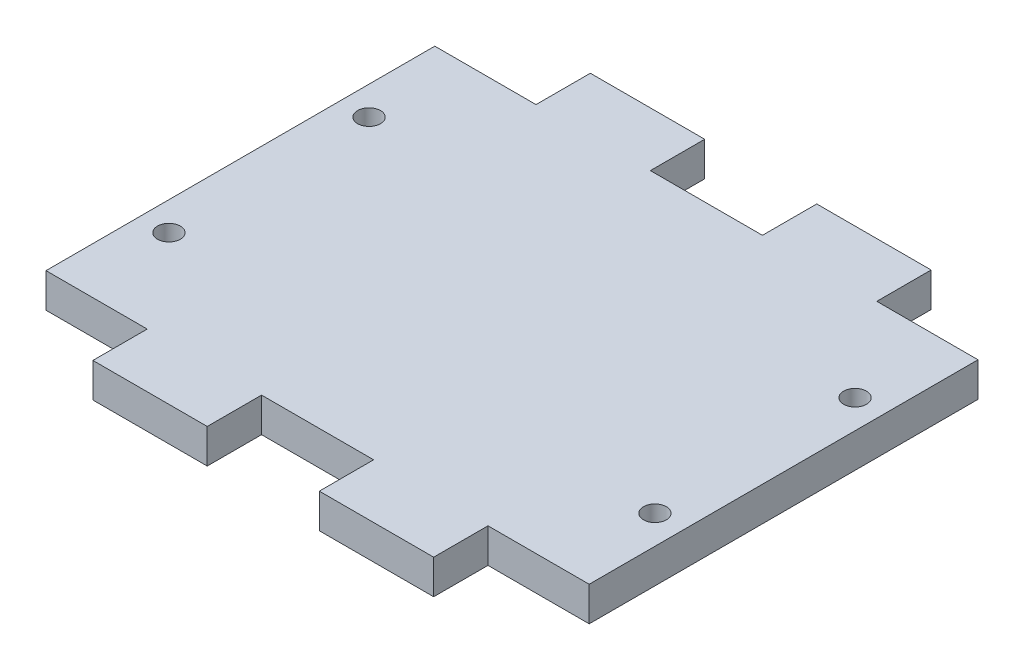
ISO-10303-21;
HEADER;
FILE_DESCRIPTION(('STEP AP214'),'2;1');
FILE_NAME('part.step','',(''),(''),'','','');
FILE_SCHEMA(('AUTOMOTIVE_DESIGN { 1 0 10303 214 1 1 1 1 }'));
ENDSEC;
DATA;
#1=APPLICATION_CONTEXT('core data for automotive mechanical design processes');
#2=APPLICATION_PROTOCOL_DEFINITION('international standard','automotive_design',2000,#1);
#3=PRODUCT_CONTEXT('',#1,'mechanical');
#4=PRODUCT('Part','Part','',(#3));
#5=PRODUCT_RELATED_PRODUCT_CATEGORY('part','',(#4));
#6=PRODUCT_DEFINITION_FORMATION('','',#4);
#7=PRODUCT_DEFINITION_CONTEXT('part definition',#1,'design');
#8=PRODUCT_DEFINITION('design','',#6,#7);
#9=PRODUCT_DEFINITION_SHAPE('','',#8);
#10=(LENGTH_UNIT() NAMED_UNIT(*) SI_UNIT(.MILLI.,.METRE.));
#11=(NAMED_UNIT(*) PLANE_ANGLE_UNIT() SI_UNIT($,.RADIAN.));
#12=(NAMED_UNIT(*) SI_UNIT($,.STERADIAN.) SOLID_ANGLE_UNIT());
#13=UNCERTAINTY_MEASURE_WITH_UNIT(LENGTH_MEASURE(1.E-05),#10,'distance_accuracy_value','');
#14=(GEOMETRIC_REPRESENTATION_CONTEXT(3) GLOBAL_UNCERTAINTY_ASSIGNED_CONTEXT((#13)) GLOBAL_UNIT_ASSIGNED_CONTEXT((#10,
#11,#12)) REPRESENTATION_CONTEXT('',''));
#15=CARTESIAN_POINT('',(0.,0.,0.));
#16=DIRECTION('',(0.,0.,1.));
#17=DIRECTION('',(1.,0.,0.));
#18=AXIS2_PLACEMENT_3D('',#15,#16,#17);
#19=CARTESIAN_POINT('',(4.89999999999999,3.,0.));
#20=DIRECTION('',(-1.,0.,0.));
#21=DIRECTION('',(0.,0.,1.));
#22=AXIS2_PLACEMENT_3D('',#19,#20,#21);
#23=PLANE('',#22);
#24=DIRECTION('',(0.,0.,-1.));
#25=VECTOR('',#24,1.);
#26=CARTESIAN_POINT('',(4.89999999999999,0.,0.));
#27=LINE('',#26,#25);
#28=CARTESIAN_POINT('',(4.89999999999999,0.,-17.0000000000001));
#29=VERTEX_POINT('',#28);
#30=CARTESIAN_POINT('',(4.89999999999999,0.,-21.7500000000001));
#31=VERTEX_POINT('',#30);
#32=EDGE_CURVE('E215',#29,#31,#27,.T.);
#33=ORIENTED_EDGE('',*,*,#32,.F.);
#34=DIRECTION('',(0.,-1.,0.));
#35=VECTOR('',#34,1.);
#36=CARTESIAN_POINT('',(4.89999999999999,3.,-17.0000000000001));
#37=LINE('',#36,#35);
#38=CARTESIAN_POINT('',(4.89999999999999,3.,-17.0000000000001));
#39=VERTEX_POINT('',#38);
#40=EDGE_CURVE('E11',#39,#29,#37,.T.);
#41=ORIENTED_EDGE('',*,*,#40,.F.);
#42=DIRECTION('',(0.,0.,-1.));
#43=VECTOR('',#42,1.);
#44=CARTESIAN_POINT('',(4.89999999999999,3.,0.));
#45=LINE('',#44,#43);
#46=CARTESIAN_POINT('',(4.89999999999999,3.,-21.7500000000001));
#47=VERTEX_POINT('',#46);
#48=EDGE_CURVE('E285',#39,#47,#45,.T.);
#49=ORIENTED_EDGE('',*,*,#48,.T.);
#50=DIRECTION('',(0.,-1.,0.));
#51=VECTOR('',#50,1.);
#52=CARTESIAN_POINT('',(4.89999999999999,3.,-21.7500000000001));
#53=LINE('',#52,#51);
#54=EDGE_CURVE('E60',#47,#31,#53,.T.);
#55=ORIENTED_EDGE('',*,*,#54,.T.);
#56=EDGE_LOOP('',(#33,#41,#49,#55));
#57=FACE_BOUND('',#56,.T.);
#58=ADVANCED_FACE('F41',(#57),#23,.T.);
#59=CARTESIAN_POINT('',(0.,3.,-17.0000000000001));
#60=DIRECTION('',(0.,0.,1.));
#61=DIRECTION('',(1.,0.,0.));
#62=AXIS2_PLACEMENT_3D('',#59,#60,#61);
#63=PLANE('',#62);
#64=DIRECTION('',(-1.,0.,0.));
#65=VECTOR('',#64,1.);
#66=CARTESIAN_POINT('',(0.,0.,-17.0000000000001));
#67=LINE('',#66,#65);
#68=CARTESIAN_POINT('',(-4.90000000000001,0.,-17.0000000000001));
#69=VERTEX_POINT('',#68);
#70=EDGE_CURVE('E218',#29,#69,#67,.T.);
#71=ORIENTED_EDGE('',*,*,#70,.T.);
#72=DIRECTION('',(0.,-1.,0.));
#73=VECTOR('',#72,1.);
#74=CARTESIAN_POINT('',(-4.90000000000001,3.,-17.0000000000001));
#75=LINE('',#74,#73);
#76=CARTESIAN_POINT('',(-4.90000000000001,3.,-17.0000000000001));
#77=VERTEX_POINT('',#76);
#78=EDGE_CURVE('E51',#77,#69,#75,.T.);
#79=ORIENTED_EDGE('',*,*,#78,.F.);
#80=DIRECTION('',(-1.,0.,0.));
#81=VECTOR('',#80,1.);
#82=CARTESIAN_POINT('',(0.,3.,-17.0000000000001));
#83=LINE('',#82,#81);
#84=EDGE_CURVE('E476',#39,#77,#83,.T.);
#85=ORIENTED_EDGE('',*,*,#84,.F.);
#86=ORIENTED_EDGE('',*,*,#40,.T.);
#87=EDGE_LOOP('',(#71,#79,#85,#86));
#88=FACE_BOUND('',#87,.T.);
#89=ADVANCED_FACE('F374',(#88),#63,.F.);
#90=CARTESIAN_POINT('',(-4.90000000000001,3.,0.));
#91=DIRECTION('',(-1.,0.,0.));
#92=DIRECTION('',(0.,0.,1.));
#93=AXIS2_PLACEMENT_3D('',#90,#91,#92);
#94=PLANE('',#93);
#95=DIRECTION('',(0.,0.,-1.));
#96=VECTOR('',#95,1.);
#97=CARTESIAN_POINT('',(-4.90000000000001,0.,0.));
#98=LINE('',#97,#96);
#99=CARTESIAN_POINT('',(-4.90000000000001,0.,-21.7500000000001));
#100=VERTEX_POINT('',#99);
#101=EDGE_CURVE('E221',#69,#100,#98,.T.);
#102=ORIENTED_EDGE('',*,*,#101,.T.);
#103=DIRECTION('',(0.,-1.,0.));
#104=VECTOR('',#103,1.);
#105=CARTESIAN_POINT('',(-4.90000000000001,3.,-21.7500000000001));
#106=LINE('',#105,#104);
#107=CARTESIAN_POINT('',(-4.90000000000001,3.,-21.7500000000001));
#108=VERTEX_POINT('',#107);
#109=EDGE_CURVE('E335',#108,#100,#106,.T.);
#110=ORIENTED_EDGE('',*,*,#109,.F.);
#111=DIRECTION('',(0.,0.,-1.));
#112=VECTOR('',#111,1.);
#113=CARTESIAN_POINT('',(-4.90000000000001,3.,0.));
#114=LINE('',#113,#112);
#115=EDGE_CURVE('E470',#77,#108,#114,.T.);
#116=ORIENTED_EDGE('',*,*,#115,.F.);
#117=ORIENTED_EDGE('',*,*,#78,.T.);
#118=EDGE_LOOP('',(#102,#110,#116,#117));
#119=FACE_BOUND('',#118,.T.);
#120=ADVANCED_FACE('F378',(#119),#94,.F.);
#121=CARTESIAN_POINT('',(0.,3.,-21.7500000000001));
#122=DIRECTION('',(0.,0.,-1.));
#123=DIRECTION('',(-1.,0.,0.));
#124=AXIS2_PLACEMENT_3D('',#121,#122,#123);
#125=PLANE('',#124);
#126=DIRECTION('',(1.,0.,0.));
#127=VECTOR('',#126,1.);
#128=CARTESIAN_POINT('',(0.,0.,-21.7500000000001));
#129=LINE('',#128,#127);
#130=CARTESIAN_POINT('',(-14.9,0.,-21.7500000000001));
#131=VERTEX_POINT('',#130);
#132=EDGE_CURVE('E225',#131,#100,#129,.T.);
#133=ORIENTED_EDGE('',*,*,#132,.F.);
#134=DIRECTION('',(0.,-1.,0.));
#135=VECTOR('',#134,1.);
#136=CARTESIAN_POINT('',(-14.9,3.,-21.7500000000001));
#137=LINE('',#136,#135);
#138=CARTESIAN_POINT('',(-14.9,3.,-21.7500000000001));
#139=VERTEX_POINT('',#138);
#140=EDGE_CURVE('E332',#139,#131,#137,.T.);
#141=ORIENTED_EDGE('',*,*,#140,.F.);
#142=DIRECTION('',(1.,0.,0.));
#143=VECTOR('',#142,1.);
#144=CARTESIAN_POINT('',(0.,3.,-21.7500000000001));
#145=LINE('',#144,#143);
#146=EDGE_CURVE('E465',#139,#108,#145,.T.);
#147=ORIENTED_EDGE('',*,*,#146,.T.);
#148=ORIENTED_EDGE('',*,*,#109,.T.);
#149=EDGE_LOOP('',(#133,#141,#147,#148));
#150=FACE_BOUND('',#149,.T.);
#151=ADVANCED_FACE('F448',(#150),#125,.T.);
#152=CARTESIAN_POINT('',(-14.9,3.,0.));
#153=DIRECTION('',(-1.,0.,0.));
#154=DIRECTION('',(0.,0.,1.));
#155=AXIS2_PLACEMENT_3D('',#152,#153,#154);
#156=PLANE('',#155);
#157=DIRECTION('',(0.,0.,-1.));
#158=VECTOR('',#157,1.);
#159=CARTESIAN_POINT('',(-14.9,0.,0.));
#160=LINE('',#159,#158);
#161=CARTESIAN_POINT('',(-14.9,0.,-17.0000000000001));
#162=VERTEX_POINT('',#161);
#163=EDGE_CURVE('E229',#162,#131,#160,.T.);
#164=ORIENTED_EDGE('',*,*,#163,.F.);
#165=DIRECTION('',(0.,-1.,0.));
#166=VECTOR('',#165,1.);
#167=CARTESIAN_POINT('',(-14.9,3.,-17.0000000000001));
#168=LINE('',#167,#166);
#169=CARTESIAN_POINT('',(-14.9,3.,-17.0000000000001));
#170=VERTEX_POINT('',#169);
#171=EDGE_CURVE('E329',#170,#162,#168,.T.);
#172=ORIENTED_EDGE('',*,*,#171,.F.);
#173=DIRECTION('',(0.,0.,-1.));
#174=VECTOR('',#173,1.);
#175=CARTESIAN_POINT('',(-14.9,3.,0.));
#176=LINE('',#175,#174);
#177=EDGE_CURVE('E469',#170,#139,#176,.T.);
#178=ORIENTED_EDGE('',*,*,#177,.T.);
#179=ORIENTED_EDGE('',*,*,#140,.T.);
#180=EDGE_LOOP('',(#164,#172,#178,#179));
#181=FACE_BOUND('',#180,.T.);
#182=ADVANCED_FACE('F444',(#181),#156,.T.);
#183=CARTESIAN_POINT('',(0.,3.,-17.0000000000001));
#184=DIRECTION('',(0.,0.,1.));
#185=DIRECTION('',(1.,0.,0.));
#186=AXIS2_PLACEMENT_3D('',#183,#184,#185);
#187=PLANE('',#186);
#188=DIRECTION('',(-1.,0.,0.));
#189=VECTOR('',#188,1.);
#190=CARTESIAN_POINT('',(0.,0.,-17.0000000000001));
#191=LINE('',#190,#189);
#192=CARTESIAN_POINT('',(-23.75,0.,-17.0000000000001));
#193=VERTEX_POINT('',#192);
#194=EDGE_CURVE('E233',#162,#193,#191,.T.);
#195=ORIENTED_EDGE('',*,*,#194,.T.);
#196=DIRECTION('',(0.,-1.,0.));
#197=VECTOR('',#196,1.);
#198=CARTESIAN_POINT('',(-23.75,3.,-17.0000000000001));
#199=LINE('',#198,#197);
#200=CARTESIAN_POINT('',(-23.75,3.,-17.0000000000001));
#201=VERTEX_POINT('',#200);
#202=EDGE_CURVE('E326',#201,#193,#199,.T.);
#203=ORIENTED_EDGE('',*,*,#202,.F.);
#204=DIRECTION('',(-1.,0.,0.));
#205=VECTOR('',#204,1.);
#206=CARTESIAN_POINT('',(0.,3.,-17.0000000000001));
#207=LINE('',#206,#205);
#208=EDGE_CURVE('E474',#170,#201,#207,.T.);
#209=ORIENTED_EDGE('',*,*,#208,.F.);
#210=ORIENTED_EDGE('',*,*,#171,.T.);
#211=EDGE_LOOP('',(#195,#203,#209,#210));
#212=FACE_BOUND('',#211,.T.);
#213=ADVANCED_FACE('F440',(#212),#187,.F.);
#214=CARTESIAN_POINT('',(-23.75,3.,0.));
#215=DIRECTION('',(-1.,0.,0.));
#216=DIRECTION('',(0.,0.,1.));
#217=AXIS2_PLACEMENT_3D('',#214,#215,#216);
#218=PLANE('',#217);
#219=DIRECTION('',(0.,0.,-1.));
#220=VECTOR('',#219,1.);
#221=CARTESIAN_POINT('',(-23.75,0.,0.));
#222=LINE('',#221,#220);
#223=CARTESIAN_POINT('',(-23.75,0.,16.9999999999999));
#224=VERTEX_POINT('',#223);
#225=EDGE_CURVE('E237',#224,#193,#222,.T.);
#226=ORIENTED_EDGE('',*,*,#225,.F.);
#227=DIRECTION('',(0.,-1.,0.));
#228=VECTOR('',#227,1.);
#229=CARTESIAN_POINT('',(-23.75,3.,16.9999999999999));
#230=LINE('',#229,#228);
#231=CARTESIAN_POINT('',(-23.75,3.,16.9999999999999));
#232=VERTEX_POINT('',#231);
#233=EDGE_CURVE('E323',#232,#224,#230,.T.);
#234=ORIENTED_EDGE('',*,*,#233,.F.);
#235=DIRECTION('',(0.,0.,-1.));
#236=VECTOR('',#235,1.);
#237=CARTESIAN_POINT('',(-23.75,3.,0.));
#238=LINE('',#237,#236);
#239=EDGE_CURVE('E482',#232,#201,#238,.T.);
#240=ORIENTED_EDGE('',*,*,#239,.T.);
#241=ORIENTED_EDGE('',*,*,#202,.T.);
#242=EDGE_LOOP('',(#226,#234,#240,#241));
#243=FACE_BOUND('',#242,.T.);
#244=ADVANCED_FACE('F436',(#243),#218,.T.);
#245=CARTESIAN_POINT('',(0.,3.,16.9999999999999));
#246=DIRECTION('',(0.,0.,-1.));
#247=DIRECTION('',(-1.,0.,0.));
#248=AXIS2_PLACEMENT_3D('',#245,#246,#247);
#249=PLANE('',#248);
#250=DIRECTION('',(1.,0.,0.));
#251=VECTOR('',#250,1.);
#252=CARTESIAN_POINT('',(0.,0.,16.9999999999999));
#253=LINE('',#252,#251);
#254=CARTESIAN_POINT('',(-14.9,0.,16.9999999999999));
#255=VERTEX_POINT('',#254);
#256=EDGE_CURVE('E241',#224,#255,#253,.T.);
#257=ORIENTED_EDGE('',*,*,#256,.T.);
#258=DIRECTION('',(0.,-1.,0.));
#259=VECTOR('',#258,1.);
#260=CARTESIAN_POINT('',(-14.9,3.,16.9999999999999));
#261=LINE('',#260,#259);
#262=CARTESIAN_POINT('',(-14.9,3.,16.9999999999999));
#263=VERTEX_POINT('',#262);
#264=EDGE_CURVE('E319',#263,#255,#261,.T.);
#265=ORIENTED_EDGE('',*,*,#264,.F.);
#266=DIRECTION('',(1.,0.,0.));
#267=VECTOR('',#266,1.);
#268=CARTESIAN_POINT('',(0.,3.,16.9999999999999));
#269=LINE('',#268,#267);
#270=EDGE_CURVE('E486',#232,#263,#269,.T.);
#271=ORIENTED_EDGE('',*,*,#270,.F.);
#272=ORIENTED_EDGE('',*,*,#233,.T.);
#273=EDGE_LOOP('',(#257,#265,#271,#272));
#274=FACE_BOUND('',#273,.T.);
#275=ADVANCED_FACE('F432',(#274),#249,.F.);
#276=CARTESIAN_POINT('',(-14.9,3.,0.));
#277=DIRECTION('',(1.,0.,0.));
#278=DIRECTION('',(0.,0.,-1.));
#279=AXIS2_PLACEMENT_3D('',#276,#277,#278);
#280=PLANE('',#279);
#281=DIRECTION('',(0.,0.,1.));
#282=VECTOR('',#281,1.);
#283=CARTESIAN_POINT('',(-14.9,0.,0.));
#284=LINE('',#283,#282);
#285=CARTESIAN_POINT('',(-14.9,0.,21.7499999999999));
#286=VERTEX_POINT('',#285);
#287=EDGE_CURVE('E244',#255,#286,#284,.T.);
#288=ORIENTED_EDGE('',*,*,#287,.T.);
#289=DIRECTION('',(0.,-1.,0.));
#290=VECTOR('',#289,1.);
#291=CARTESIAN_POINT('',(-14.9,3.,21.7499999999999));
#292=LINE('',#291,#290);
#293=CARTESIAN_POINT('',(-14.9,3.,21.7499999999999));
#294=VERTEX_POINT('',#293);
#295=EDGE_CURVE('E315',#294,#286,#292,.T.);
#296=ORIENTED_EDGE('',*,*,#295,.F.);
#297=DIRECTION('',(0.,0.,1.));
#298=VECTOR('',#297,1.);
#299=CARTESIAN_POINT('',(-14.9,3.,0.));
#300=LINE('',#299,#298);
#301=EDGE_CURVE('E489',#263,#294,#300,.T.);
#302=ORIENTED_EDGE('',*,*,#301,.F.);
#303=ORIENTED_EDGE('',*,*,#264,.T.);
#304=EDGE_LOOP('',(#288,#296,#302,#303));
#305=FACE_BOUND('',#304,.T.);
#306=ADVANCED_FACE('F428',(#305),#280,.F.);
#307=CARTESIAN_POINT('',(0.,3.,21.7499999999999));
#308=DIRECTION('',(0.,0.,-1.));
#309=DIRECTION('',(-1.,0.,0.));
#310=AXIS2_PLACEMENT_3D('',#307,#308,#309);
#311=PLANE('',#310);
#312=DIRECTION('',(1.,0.,0.));
#313=VECTOR('',#312,1.);
#314=CARTESIAN_POINT('',(0.,0.,21.7499999999999));
#315=LINE('',#314,#313);
#316=CARTESIAN_POINT('',(-4.9,0.,21.7499999999999));
#317=VERTEX_POINT('',#316);
#318=EDGE_CURVE('E247',#286,#317,#315,.T.);
#319=ORIENTED_EDGE('',*,*,#318,.T.);
#320=DIRECTION('',(0.,-1.,0.));
#321=VECTOR('',#320,1.);
#322=CARTESIAN_POINT('',(-4.9,3.,21.7499999999999));
#323=LINE('',#322,#321);
#324=CARTESIAN_POINT('',(-4.9,3.,21.7499999999999));
#325=VERTEX_POINT('',#324);
#326=EDGE_CURVE('E312',#325,#317,#323,.T.);
#327=ORIENTED_EDGE('',*,*,#326,.F.);
#328=DIRECTION('',(1.,0.,0.));
#329=VECTOR('',#328,1.);
#330=CARTESIAN_POINT('',(0.,3.,21.7499999999999));
#331=LINE('',#330,#329);
#332=EDGE_CURVE('E492',#294,#325,#331,.T.);
#333=ORIENTED_EDGE('',*,*,#332,.F.);
#334=ORIENTED_EDGE('',*,*,#295,.T.);
#335=EDGE_LOOP('',(#319,#327,#333,#334));
#336=FACE_BOUND('',#335,.T.);
#337=ADVANCED_FACE('F424',(#336),#311,.F.);
#338=CARTESIAN_POINT('',(-4.90000000000001,3.,0.));
#339=DIRECTION('',(1.,0.,0.));
#340=DIRECTION('',(0.,0.,-1.));
#341=AXIS2_PLACEMENT_3D('',#338,#339,#340);
#342=PLANE('',#341);
#343=DIRECTION('',(0.,0.,1.));
#344=VECTOR('',#343,1.);
#345=CARTESIAN_POINT('',(-4.90000000000001,0.,0.));
#346=LINE('',#345,#344);
#347=CARTESIAN_POINT('',(-4.90000000000001,0.,16.9999999999999));
#348=VERTEX_POINT('',#347);
#349=EDGE_CURVE('E251',#348,#317,#346,.T.);
#350=ORIENTED_EDGE('',*,*,#349,.F.);
#351=DIRECTION('',(0.,-1.,0.));
#352=VECTOR('',#351,1.);
#353=CARTESIAN_POINT('',(-4.90000000000001,3.,16.9999999999999));
#354=LINE('',#353,#352);
#355=CARTESIAN_POINT('',(-4.90000000000001,3.,16.9999999999999));
#356=VERTEX_POINT('',#355);
#357=EDGE_CURVE('E309',#356,#348,#354,.T.);
#358=ORIENTED_EDGE('',*,*,#357,.F.);
#359=DIRECTION('',(0.,0.,1.));
#360=VECTOR('',#359,1.);
#361=CARTESIAN_POINT('',(-4.90000000000001,3.,0.));
#362=LINE('',#361,#360);
#363=EDGE_CURVE('E495',#356,#325,#362,.T.);
#364=ORIENTED_EDGE('',*,*,#363,.T.);
#365=ORIENTED_EDGE('',*,*,#326,.T.);
#366=EDGE_LOOP('',(#350,#358,#364,#365));
#367=FACE_BOUND('',#366,.T.);
#368=ADVANCED_FACE('F420',(#367),#342,.T.);
#369=CARTESIAN_POINT('',(0.,3.,16.9999999999999));
#370=DIRECTION('',(0.,0.,-1.));
#371=DIRECTION('',(-1.,0.,0.));
#372=AXIS2_PLACEMENT_3D('',#369,#370,#371);
#373=PLANE('',#372);
#374=DIRECTION('',(1.,0.,0.));
#375=VECTOR('',#374,1.);
#376=CARTESIAN_POINT('',(0.,0.,16.9999999999999));
#377=LINE('',#376,#375);
#378=CARTESIAN_POINT('',(4.89999999999999,0.,16.9999999999999));
#379=VERTEX_POINT('',#378);
#380=EDGE_CURVE('E255',#348,#379,#377,.T.);
#381=ORIENTED_EDGE('',*,*,#380,.T.);
#382=DIRECTION('',(0.,-1.,0.));
#383=VECTOR('',#382,1.);
#384=CARTESIAN_POINT('',(4.89999999999999,3.,16.9999999999999));
#385=LINE('',#384,#383);
#386=CARTESIAN_POINT('',(4.89999999999999,3.,16.9999999999999));
#387=VERTEX_POINT('',#386);
#388=EDGE_CURVE('E305',#387,#379,#385,.T.);
#389=ORIENTED_EDGE('',*,*,#388,.F.);
#390=DIRECTION('',(1.,0.,0.));
#391=VECTOR('',#390,1.);
#392=CARTESIAN_POINT('',(0.,3.,16.9999999999999));
#393=LINE('',#392,#391);
#394=EDGE_CURVE('E499',#356,#387,#393,.T.);
#395=ORIENTED_EDGE('',*,*,#394,.F.);
#396=ORIENTED_EDGE('',*,*,#357,.T.);
#397=EDGE_LOOP('',(#381,#389,#395,#396));
#398=FACE_BOUND('',#397,.T.);
#399=ADVANCED_FACE('F416',(#398),#373,.F.);
#400=CARTESIAN_POINT('',(4.89999999999997,3.,0.));
#401=DIRECTION('',(1.,0.,0.));
#402=DIRECTION('',(0.,0.,-1.));
#403=AXIS2_PLACEMENT_3D('',#400,#401,#402);
#404=PLANE('',#403);
#405=DIRECTION('',(0.,0.,1.));
#406=VECTOR('',#405,1.);
#407=CARTESIAN_POINT('',(4.89999999999997,0.,0.));
#408=LINE('',#407,#406);
#409=CARTESIAN_POINT('',(4.89999999999999,0.,21.7499999999999));
#410=VERTEX_POINT('',#409);
#411=EDGE_CURVE('E258',#379,#410,#408,.T.);
#412=ORIENTED_EDGE('',*,*,#411,.T.);
#413=DIRECTION('',(0.,-1.,0.));
#414=VECTOR('',#413,1.);
#415=CARTESIAN_POINT('',(4.89999999999999,3.,21.7499999999999));
#416=LINE('',#415,#414);
#417=CARTESIAN_POINT('',(4.89999999999999,3.,21.7499999999999));
#418=VERTEX_POINT('',#417);
#419=EDGE_CURVE('E301',#418,#410,#416,.T.);
#420=ORIENTED_EDGE('',*,*,#419,.F.);
#421=DIRECTION('',(0.,0.,1.));
#422=VECTOR('',#421,1.);
#423=CARTESIAN_POINT('',(4.89999999999997,3.,0.));
#424=LINE('',#423,#422);
#425=EDGE_CURVE('E502',#387,#418,#424,.T.);
#426=ORIENTED_EDGE('',*,*,#425,.F.);
#427=ORIENTED_EDGE('',*,*,#388,.T.);
#428=EDGE_LOOP('',(#412,#420,#426,#427));
#429=FACE_BOUND('',#428,.T.);
#430=ADVANCED_FACE('F412',(#429),#404,.F.);
#431=CARTESIAN_POINT('',(0.,3.,21.7499999999999));
#432=DIRECTION('',(0.,0.,-1.));
#433=DIRECTION('',(-1.,0.,0.));
#434=AXIS2_PLACEMENT_3D('',#431,#432,#433);
#435=PLANE('',#434);
#436=DIRECTION('',(1.,0.,0.));
#437=VECTOR('',#436,1.);
#438=CARTESIAN_POINT('',(0.,0.,21.7499999999999));
#439=LINE('',#438,#437);
#440=CARTESIAN_POINT('',(14.9,0.,21.7499999999999));
#441=VERTEX_POINT('',#440);
#442=EDGE_CURVE('E261',#410,#441,#439,.T.);
#443=ORIENTED_EDGE('',*,*,#442,.T.);
#444=DIRECTION('',(0.,-1.,0.));
#445=VECTOR('',#444,1.);
#446=CARTESIAN_POINT('',(14.9,3.,21.7499999999999));
#447=LINE('',#446,#445);
#448=CARTESIAN_POINT('',(14.9,3.,21.7499999999999));
#449=VERTEX_POINT('',#448);
#450=EDGE_CURVE('E298',#449,#441,#447,.T.);
#451=ORIENTED_EDGE('',*,*,#450,.F.);
#452=DIRECTION('',(1.,0.,0.));
#453=VECTOR('',#452,1.);
#454=CARTESIAN_POINT('',(0.,3.,21.7499999999999));
#455=LINE('',#454,#453);
#456=EDGE_CURVE('E505',#418,#449,#455,.T.);
#457=ORIENTED_EDGE('',*,*,#456,.F.);
#458=ORIENTED_EDGE('',*,*,#419,.T.);
#459=EDGE_LOOP('',(#443,#451,#457,#458));
#460=FACE_BOUND('',#459,.T.);
#461=ADVANCED_FACE('F408',(#460),#435,.F.);
#462=CARTESIAN_POINT('',(14.9,3.,0.));
#463=DIRECTION('',(1.,0.,0.));
#464=DIRECTION('',(0.,0.,-1.));
#465=AXIS2_PLACEMENT_3D('',#462,#463,#464);
#466=PLANE('',#465);
#467=DIRECTION('',(0.,0.,1.));
#468=VECTOR('',#467,1.);
#469=CARTESIAN_POINT('',(14.9,0.,0.));
#470=LINE('',#469,#468);
#471=CARTESIAN_POINT('',(14.9,0.,16.9999999999999));
#472=VERTEX_POINT('',#471);
#473=EDGE_CURVE('E265',#472,#441,#470,.T.);
#474=ORIENTED_EDGE('',*,*,#473,.F.);
#475=DIRECTION('',(0.,-1.,0.));
#476=VECTOR('',#475,1.);
#477=CARTESIAN_POINT('',(14.9,3.,16.9999999999999));
#478=LINE('',#477,#476);
#479=CARTESIAN_POINT('',(14.9,3.,16.9999999999999));
#480=VERTEX_POINT('',#479);
#481=EDGE_CURVE('E295',#480,#472,#478,.T.);
#482=ORIENTED_EDGE('',*,*,#481,.F.);
#483=DIRECTION('',(0.,0.,1.));
#484=VECTOR('',#483,1.);
#485=CARTESIAN_POINT('',(14.9,3.,0.));
#486=LINE('',#485,#484);
#487=EDGE_CURVE('E508',#480,#449,#486,.T.);
#488=ORIENTED_EDGE('',*,*,#487,.T.);
#489=ORIENTED_EDGE('',*,*,#450,.T.);
#490=EDGE_LOOP('',(#474,#482,#488,#489));
#491=FACE_BOUND('',#490,.T.);
#492=ADVANCED_FACE('F404',(#491),#466,.T.);
#493=CARTESIAN_POINT('',(0.,3.,16.9999999999999));
#494=DIRECTION('',(0.,0.,1.));
#495=DIRECTION('',(1.,0.,0.));
#496=AXIS2_PLACEMENT_3D('',#493,#494,#495);
#497=PLANE('',#496);
#498=DIRECTION('',(-1.,0.,0.));
#499=VECTOR('',#498,1.);
#500=CARTESIAN_POINT('',(0.,0.,16.9999999999999));
#501=LINE('',#500,#499);
#502=CARTESIAN_POINT('',(23.75,0.,16.9999999999999));
#503=VERTEX_POINT('',#502);
#504=EDGE_CURVE('E269',#503,#472,#501,.T.);
#505=ORIENTED_EDGE('',*,*,#504,.F.);
#506=DIRECTION('',(0.,-1.,0.));
#507=VECTOR('',#506,1.);
#508=CARTESIAN_POINT('',(23.75,3.,16.9999999999999));
#509=LINE('',#508,#507);
#510=CARTESIAN_POINT('',(23.75,3.,16.9999999999999));
#511=VERTEX_POINT('',#510);
#512=EDGE_CURVE('E292',#511,#503,#509,.T.);
#513=ORIENTED_EDGE('',*,*,#512,.F.);
#514=DIRECTION('',(-1.,0.,0.));
#515=VECTOR('',#514,1.);
#516=CARTESIAN_POINT('',(0.,3.,16.9999999999999));
#517=LINE('',#516,#515);
#518=EDGE_CURVE('E512',#511,#480,#517,.T.);
#519=ORIENTED_EDGE('',*,*,#518,.T.);
#520=ORIENTED_EDGE('',*,*,#481,.T.);
#521=EDGE_LOOP('',(#505,#513,#519,#520));
#522=FACE_BOUND('',#521,.T.);
#523=ADVANCED_FACE('F400',(#522),#497,.T.);
#524=CARTESIAN_POINT('',(23.75,3.,0.));
#525=DIRECTION('',(-1.,0.,0.));
#526=DIRECTION('',(0.,0.,1.));
#527=AXIS2_PLACEMENT_3D('',#524,#525,#526);
#528=PLANE('',#527);
#529=DIRECTION('',(0.,0.,-1.));
#530=VECTOR('',#529,1.);
#531=CARTESIAN_POINT('',(23.75,0.,0.));
#532=LINE('',#531,#530);
#533=CARTESIAN_POINT('',(23.75,0.,-17.0000000000001));
#534=VERTEX_POINT('',#533);
#535=EDGE_CURVE('E273',#503,#534,#532,.T.);
#536=ORIENTED_EDGE('',*,*,#535,.T.);
#537=DIRECTION('',(0.,-1.,0.));
#538=VECTOR('',#537,1.);
#539=CARTESIAN_POINT('',(23.75,3.,-17.0000000000001));
#540=LINE('',#539,#538);
#541=CARTESIAN_POINT('',(23.75,3.,-17.0000000000001));
#542=VERTEX_POINT('',#541);
#543=EDGE_CURVE('E205',#542,#534,#540,.T.);
#544=ORIENTED_EDGE('',*,*,#543,.F.);
#545=DIRECTION('',(0.,0.,-1.));
#546=VECTOR('',#545,1.);
#547=CARTESIAN_POINT('',(23.75,3.,0.));
#548=LINE('',#547,#546);
#549=EDGE_CURVE('E191',#511,#542,#548,.T.);
#550=ORIENTED_EDGE('',*,*,#549,.F.);
#551=ORIENTED_EDGE('',*,*,#512,.T.);
#552=EDGE_LOOP('',(#536,#544,#550,#551));
#553=FACE_BOUND('',#552,.T.);
#554=ADVANCED_FACE('F397',(#553),#528,.F.);
#555=CARTESIAN_POINT('',(0.,3.,-17.0000000000001));
#556=DIRECTION('',(0.,0.,1.));
#557=DIRECTION('',(1.,0.,0.));
#558=AXIS2_PLACEMENT_3D('',#555,#556,#557);
#559=PLANE('',#558);
#560=DIRECTION('',(-1.,0.,0.));
#561=VECTOR('',#560,1.);
#562=CARTESIAN_POINT('',(0.,0.,-17.0000000000001));
#563=LINE('',#562,#561);
#564=CARTESIAN_POINT('',(14.9,0.,-17.0000000000001));
#565=VERTEX_POINT('',#564);
#566=EDGE_CURVE('E201',#534,#565,#563,.T.);
#567=ORIENTED_EDGE('',*,*,#566,.T.);
#568=DIRECTION('',(0.,-1.,0.));
#569=VECTOR('',#568,1.);
#570=CARTESIAN_POINT('',(14.9,3.,-17.0000000000001));
#571=LINE('',#570,#569);
#572=CARTESIAN_POINT('',(14.9,3.,-17.0000000000001));
#573=VERTEX_POINT('',#572);
#574=EDGE_CURVE('E198',#573,#565,#571,.T.);
#575=ORIENTED_EDGE('',*,*,#574,.F.);
#576=DIRECTION('',(-1.,0.,0.));
#577=VECTOR('',#576,1.);
#578=CARTESIAN_POINT('',(0.,3.,-17.0000000000001));
#579=LINE('',#578,#577);
#580=EDGE_CURVE('E182',#542,#573,#579,.T.);
#581=ORIENTED_EDGE('',*,*,#580,.F.);
#582=ORIENTED_EDGE('',*,*,#543,.T.);
#583=EDGE_LOOP('',(#567,#575,#581,#582));
#584=FACE_BOUND('',#583,.T.);
#585=ADVANCED_FACE('F199',(#584),#559,.F.);
#586=CARTESIAN_POINT('',(14.9,3.,0.));
#587=DIRECTION('',(-1.,0.,0.));
#588=DIRECTION('',(0.,0.,1.));
#589=AXIS2_PLACEMENT_3D('',#586,#587,#588);
#590=PLANE('',#589);
#591=DIRECTION('',(0.,0.,-1.));
#592=VECTOR('',#591,1.);
#593=CARTESIAN_POINT('',(14.9,0.,0.));
#594=LINE('',#593,#592);
#595=CARTESIAN_POINT('',(14.9,0.,-21.7500000000001));
#596=VERTEX_POINT('',#595);
#597=EDGE_CURVE('E278',#565,#596,#594,.T.);
#598=ORIENTED_EDGE('',*,*,#597,.T.);
#599=DIRECTION('',(0.,-1.,0.));
#600=VECTOR('',#599,1.);
#601=CARTESIAN_POINT('',(14.9,3.,-21.7500000000001));
#602=LINE('',#601,#600);
#603=CARTESIAN_POINT('',(14.9,3.,-21.7500000000001));
#604=VERTEX_POINT('',#603);
#605=EDGE_CURVE('E122',#604,#596,#602,.T.);
#606=ORIENTED_EDGE('',*,*,#605,.F.);
#607=DIRECTION('',(0.,0.,-1.));
#608=VECTOR('',#607,1.);
#609=CARTESIAN_POINT('',(14.9,3.,0.));
#610=LINE('',#609,#608);
#611=EDGE_CURVE('E188',#573,#604,#610,.T.);
#612=ORIENTED_EDGE('',*,*,#611,.F.);
#613=ORIENTED_EDGE('',*,*,#574,.T.);
#614=EDGE_LOOP('',(#598,#606,#612,#613));
#615=FACE_BOUND('',#614,.T.);
#616=ADVANCED_FACE('F207',(#615),#590,.F.);
#617=CARTESIAN_POINT('',(0.,3.,-21.7500000000001));
#618=DIRECTION('',(0.,0.,-1.));
#619=DIRECTION('',(-1.,0.,0.));
#620=AXIS2_PLACEMENT_3D('',#617,#618,#619);
#621=PLANE('',#620);
#622=DIRECTION('',(1.,0.,0.));
#623=VECTOR('',#622,1.);
#624=CARTESIAN_POINT('',(0.,0.,-21.7500000000001));
#625=LINE('',#624,#623);
#626=EDGE_CURVE('E281',#31,#596,#625,.T.);
#627=ORIENTED_EDGE('',*,*,#626,.F.);
#628=ORIENTED_EDGE('',*,*,#54,.F.);
#629=DIRECTION('',(1.,0.,0.));
#630=VECTOR('',#629,1.);
#631=CARTESIAN_POINT('',(0.,3.,-21.7500000000001));
#632=LINE('',#631,#630);
#633=EDGE_CURVE('E209',#47,#604,#632,.T.);
#634=ORIENTED_EDGE('',*,*,#633,.T.);
#635=ORIENTED_EDGE('',*,*,#605,.T.);
#636=EDGE_LOOP('',(#627,#628,#634,#635));
#637=FACE_BOUND('',#636,.T.);
#638=ADVANCED_FACE('F383',(#637),#621,.T.);
#639=CARTESIAN_POINT('',(0.,3.,0.));
#640=DIRECTION('',(0.,1.,0.));
#641=DIRECTION('',(0.,0.,1.));
#642=AXIS2_PLACEMENT_3D('',#639,#640,#641);
#643=PLANE('',#642);
#644=CARTESIAN_POINT('',(21.25,3.,-8.75000000000007));
#645=DIRECTION('',(0.,1.,0.));
#646=DIRECTION('',(0.,0.,1.));
#647=AXIS2_PLACEMENT_3D('',#644,#645,#646);
#648=CIRCLE('',#647,1.);
#649=CARTESIAN_POINT('',(21.25,3.,-7.75000000000007));
#650=VERTEX_POINT('',#649);
#651=EDGE_CURVE('E552',#650,#650,#648,.T.);
#652=ORIENTED_EDGE('',*,*,#651,.F.);
#653=EDGE_LOOP('',(#652));
#654=FACE_BOUND('',#653,.T.);
#655=CARTESIAN_POINT('',(21.25,3.,8.74999999999993));
#656=DIRECTION('',(0.,1.,0.));
#657=DIRECTION('',(0.,0.,1.));
#658=AXIS2_PLACEMENT_3D('',#655,#656,#657);
#659=CIRCLE('',#658,1.);
#660=CARTESIAN_POINT('',(21.25,3.,9.74999999999993));
#661=VERTEX_POINT('',#660);
#662=EDGE_CURVE('E555',#661,#661,#659,.T.);
#663=ORIENTED_EDGE('',*,*,#662,.F.);
#664=EDGE_LOOP('',(#663));
#665=FACE_BOUND('',#664,.T.);
#666=CARTESIAN_POINT('',(-21.25,3.,8.74999999999994));
#667=DIRECTION('',(0.,1.,0.));
#668=DIRECTION('',(0.,0.,1.));
#669=AXIS2_PLACEMENT_3D('',#666,#667,#668);
#670=CIRCLE('',#669,1.);
#671=CARTESIAN_POINT('',(-21.25,3.,9.74999999999994));
#672=VERTEX_POINT('',#671);
#673=EDGE_CURVE('E551',#672,#672,#670,.T.);
#674=ORIENTED_EDGE('',*,*,#673,.F.);
#675=EDGE_LOOP('',(#674));
#676=FACE_BOUND('',#675,.T.);
#677=CARTESIAN_POINT('',(-21.25,3.,-8.75000000000007));
#678=DIRECTION('',(0.,1.,0.));
#679=DIRECTION('',(0.,0.,1.));
#680=AXIS2_PLACEMENT_3D('',#677,#678,#679);
#681=CIRCLE('',#680,1.);
#682=CARTESIAN_POINT('',(-21.25,3.,-7.75000000000006));
#683=VERTEX_POINT('',#682);
#684=EDGE_CURVE('E346',#683,#683,#681,.T.);
#685=ORIENTED_EDGE('',*,*,#684,.F.);
#686=EDGE_LOOP('',(#685));
#687=FACE_BOUND('',#686,.T.);
#688=ORIENTED_EDGE('',*,*,#48,.F.);
#689=ORIENTED_EDGE('',*,*,#84,.T.);
#690=ORIENTED_EDGE('',*,*,#115,.T.);
#691=ORIENTED_EDGE('',*,*,#146,.F.);
#692=ORIENTED_EDGE('',*,*,#177,.F.);
#693=ORIENTED_EDGE('',*,*,#208,.T.);
#694=ORIENTED_EDGE('',*,*,#239,.F.);
#695=ORIENTED_EDGE('',*,*,#270,.T.);
#696=ORIENTED_EDGE('',*,*,#301,.T.);
#697=ORIENTED_EDGE('',*,*,#332,.T.);
#698=ORIENTED_EDGE('',*,*,#363,.F.);
#699=ORIENTED_EDGE('',*,*,#394,.T.);
#700=ORIENTED_EDGE('',*,*,#425,.T.);
#701=ORIENTED_EDGE('',*,*,#456,.T.);
#702=ORIENTED_EDGE('',*,*,#487,.F.);
#703=ORIENTED_EDGE('',*,*,#518,.F.);
#704=ORIENTED_EDGE('',*,*,#549,.T.);
#705=ORIENTED_EDGE('',*,*,#580,.T.);
#706=ORIENTED_EDGE('',*,*,#611,.T.);
#707=ORIENTED_EDGE('',*,*,#633,.F.);
#708=EDGE_LOOP('',(#688,#689,#690,#691,#692,#693,#694,#695,#696,#697,#698,#699,#700,#701,#702,
#703,#704,#705,#706,#707));
#709=FACE_BOUND('',#708,.T.);
#710=ADVANCED_FACE('F185',(#654,#665,#676,#687,#709),#643,.T.);
#711=CARTESIAN_POINT('',(0.,0.,0.));
#712=DIRECTION('',(0.,1.,0.));
#713=DIRECTION('',(0.,0.,1.));
#714=AXIS2_PLACEMENT_3D('',#711,#712,#713);
#715=PLANE('',#714);
#716=CARTESIAN_POINT('',(21.25,0.,-8.75000000000007));
#717=DIRECTION('',(0.,1.,0.));
#718=DIRECTION('',(0.,0.,1.));
#719=AXIS2_PLACEMENT_3D('',#716,#717,#718);
#720=CIRCLE('',#719,1.);
#721=CARTESIAN_POINT('',(21.25,0.,-7.75000000000007));
#722=VERTEX_POINT('',#721);
#723=EDGE_CURVE('E44',#722,#722,#720,.T.);
#724=ORIENTED_EDGE('',*,*,#723,.T.);
#725=EDGE_LOOP('',(#724));
#726=FACE_BOUND('',#725,.T.);
#727=CARTESIAN_POINT('',(21.25,0.,8.74999999999993));
#728=DIRECTION('',(0.,1.,0.));
#729=DIRECTION('',(0.,0.,1.));
#730=AXIS2_PLACEMENT_3D('',#727,#728,#729);
#731=CIRCLE('',#730,1.);
#732=CARTESIAN_POINT('',(21.25,0.,9.74999999999993));
#733=VERTEX_POINT('',#732);
#734=EDGE_CURVE('E349',#733,#733,#731,.T.);
#735=ORIENTED_EDGE('',*,*,#734,.T.);
#736=EDGE_LOOP('',(#735));
#737=FACE_BOUND('',#736,.T.);
#738=CARTESIAN_POINT('',(-21.25,0.,8.74999999999994));
#739=DIRECTION('',(0.,1.,0.));
#740=DIRECTION('',(0.,0.,1.));
#741=AXIS2_PLACEMENT_3D('',#738,#739,#740);
#742=CIRCLE('',#741,1.);
#743=CARTESIAN_POINT('',(-21.25,0.,9.74999999999994));
#744=VERTEX_POINT('',#743);
#745=EDGE_CURVE('E345',#744,#744,#742,.T.);
#746=ORIENTED_EDGE('',*,*,#745,.T.);
#747=EDGE_LOOP('',(#746));
#748=FACE_BOUND('',#747,.T.);
#749=CARTESIAN_POINT('',(-21.25,0.,-8.75000000000007));
#750=DIRECTION('',(0.,1.,0.));
#751=DIRECTION('',(0.,0.,1.));
#752=AXIS2_PLACEMENT_3D('',#749,#750,#751);
#753=CIRCLE('',#752,1.);
#754=CARTESIAN_POINT('',(-21.25,0.,-7.75000000000006));
#755=VERTEX_POINT('',#754);
#756=EDGE_CURVE('E341',#755,#755,#753,.T.);
#757=ORIENTED_EDGE('',*,*,#756,.T.);
#758=EDGE_LOOP('',(#757));
#759=FACE_BOUND('',#758,.T.);
#760=ORIENTED_EDGE('',*,*,#32,.T.);
#761=ORIENTED_EDGE('',*,*,#626,.T.);
#762=ORIENTED_EDGE('',*,*,#597,.F.);
#763=ORIENTED_EDGE('',*,*,#566,.F.);
#764=ORIENTED_EDGE('',*,*,#535,.F.);
#765=ORIENTED_EDGE('',*,*,#504,.T.);
#766=ORIENTED_EDGE('',*,*,#473,.T.);
#767=ORIENTED_EDGE('',*,*,#442,.F.);
#768=ORIENTED_EDGE('',*,*,#411,.F.);
#769=ORIENTED_EDGE('',*,*,#380,.F.);
#770=ORIENTED_EDGE('',*,*,#349,.T.);
#771=ORIENTED_EDGE('',*,*,#318,.F.);
#772=ORIENTED_EDGE('',*,*,#287,.F.);
#773=ORIENTED_EDGE('',*,*,#256,.F.);
#774=ORIENTED_EDGE('',*,*,#225,.T.);
#775=ORIENTED_EDGE('',*,*,#194,.F.);
#776=ORIENTED_EDGE('',*,*,#163,.T.);
#777=ORIENTED_EDGE('',*,*,#132,.T.);
#778=ORIENTED_EDGE('',*,*,#101,.F.);
#779=ORIENTED_EDGE('',*,*,#70,.F.);
#780=EDGE_LOOP('',(#760,#761,#762,#763,#764,#765,#766,#767,#768,#769,#770,#771,#772,#773,#774,
#775,#776,#777,#778,#779));
#781=FACE_BOUND('',#780,.T.);
#782=ADVANCED_FACE('F358',(#726,#737,#748,#759,#781),#715,.F.);
#783=CARTESIAN_POINT('',(-21.25,-7.,-8.75000000000007));
#784=DIRECTION('',(0.,1.,0.));
#785=DIRECTION('',(0.,0.,1.));
#786=AXIS2_PLACEMENT_3D('',#783,#784,#785);
#787=CYLINDRICAL_SURFACE('',#786,1.);
#788=ORIENTED_EDGE('',*,*,#684,.T.);
#789=EDGE_LOOP('',(#788));
#790=FACE_BOUND('',#789,.T.);
#791=ORIENTED_EDGE('',*,*,#756,.F.);
#792=EDGE_LOOP('',(#791));
#793=FACE_BOUND('',#792,.T.);
#794=ADVANCED_FACE('F568',(#790,#793),#787,.F.);
#795=CARTESIAN_POINT('',(-21.25,-7.,8.74999999999994));
#796=DIRECTION('',(0.,1.,0.));
#797=DIRECTION('',(0.,0.,1.));
#798=AXIS2_PLACEMENT_3D('',#795,#796,#797);
#799=CYLINDRICAL_SURFACE('',#798,1.);
#800=ORIENTED_EDGE('',*,*,#673,.T.);
#801=EDGE_LOOP('',(#800));
#802=FACE_BOUND('',#801,.T.);
#803=ORIENTED_EDGE('',*,*,#745,.F.);
#804=EDGE_LOOP('',(#803));
#805=FACE_BOUND('',#804,.T.);
#806=ADVANCED_FACE('F368',(#802,#805),#799,.F.);
#807=CARTESIAN_POINT('',(21.25,-7.,8.74999999999993));
#808=DIRECTION('',(0.,1.,0.));
#809=DIRECTION('',(0.,0.,1.));
#810=AXIS2_PLACEMENT_3D('',#807,#808,#809);
#811=CYLINDRICAL_SURFACE('',#810,1.);
#812=ORIENTED_EDGE('',*,*,#662,.T.);
#813=EDGE_LOOP('',(#812));
#814=FACE_BOUND('',#813,.T.);
#815=ORIENTED_EDGE('',*,*,#734,.F.);
#816=EDGE_LOOP('',(#815));
#817=FACE_BOUND('',#816,.T.);
#818=ADVANCED_FACE('F362',(#814,#817),#811,.F.);
#819=CARTESIAN_POINT('',(21.25,-7.,-8.75000000000007));
#820=DIRECTION('',(0.,1.,0.));
#821=DIRECTION('',(0.,0.,1.));
#822=AXIS2_PLACEMENT_3D('',#819,#820,#821);
#823=CYLINDRICAL_SURFACE('',#822,1.);
#824=ORIENTED_EDGE('',*,*,#651,.T.);
#825=EDGE_LOOP('',(#824));
#826=FACE_BOUND('',#825,.T.);
#827=ORIENTED_EDGE('',*,*,#723,.F.);
#828=EDGE_LOOP('',(#827));
#829=FACE_BOUND('',#828,.T.);
#830=ADVANCED_FACE('F360',(#826,#829),#823,.F.);
#831=CLOSED_SHELL('',(#58,#89,#120,#151,#182,#213,#244,#275,#306,#337,#368,#399,#430,#461,#492,
#523,#554,#585,#616,#638,#710,#782,#794,#806,#818,#830));
#832=MANIFOLD_SOLID_BREP('B2',#831);
#833=ADVANCED_BREP_SHAPE_REPRESENTATION('',(#18,#832),#14);
#834=SHAPE_DEFINITION_REPRESENTATION(#9,#833);
ENDSEC;
END-ISO-10303-21;
